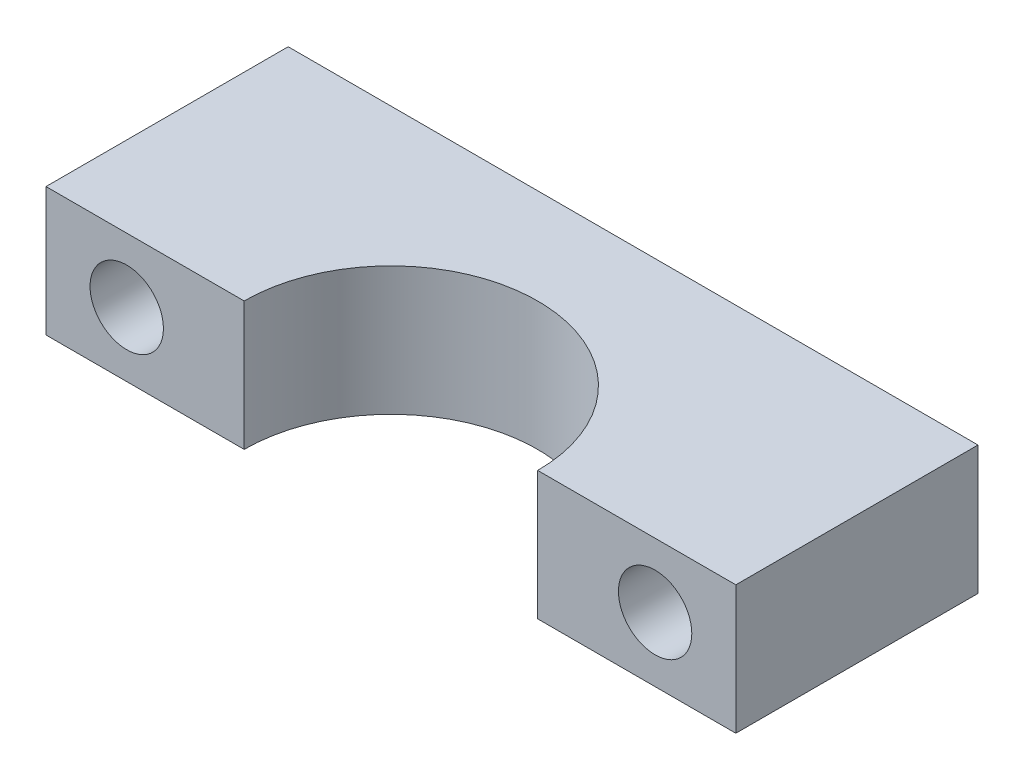
ISO-10303-21;
HEADER;
FILE_DESCRIPTION(('STEP AP214'),'2;1');
FILE_NAME('part.step','',(''),(''),'','','');
FILE_SCHEMA(('AUTOMOTIVE_DESIGN { 1 0 10303 214 1 1 1 1 }'));
ENDSEC;
DATA;
#1=APPLICATION_CONTEXT('core data for automotive mechanical design processes');
#2=APPLICATION_PROTOCOL_DEFINITION('international standard','automotive_design',2000,#1);
#3=PRODUCT_CONTEXT('',#1,'mechanical');
#4=PRODUCT('Part','Part','',(#3));
#5=PRODUCT_RELATED_PRODUCT_CATEGORY('part','',(#4));
#6=PRODUCT_DEFINITION_FORMATION('','',#4);
#7=PRODUCT_DEFINITION_CONTEXT('part definition',#1,'design');
#8=PRODUCT_DEFINITION('design','',#6,#7);
#9=PRODUCT_DEFINITION_SHAPE('','',#8);
#10=(LENGTH_UNIT() NAMED_UNIT(*) SI_UNIT(.MILLI.,.METRE.));
#11=(NAMED_UNIT(*) PLANE_ANGLE_UNIT() SI_UNIT($,.RADIAN.));
#12=(NAMED_UNIT(*) SI_UNIT($,.STERADIAN.) SOLID_ANGLE_UNIT());
#13=UNCERTAINTY_MEASURE_WITH_UNIT(LENGTH_MEASURE(1.E-05),#10,'distance_accuracy_value','');
#14=(GEOMETRIC_REPRESENTATION_CONTEXT(3) GLOBAL_UNCERTAINTY_ASSIGNED_CONTEXT((#13)) GLOBAL_UNIT_ASSIGNED_CONTEXT((#10,
#11,#12)) REPRESENTATION_CONTEXT('',''));
#15=CARTESIAN_POINT('',(0.,0.,0.));
#16=DIRECTION('',(0.,0.,1.));
#17=DIRECTION('',(1.,0.,0.));
#18=AXIS2_PLACEMENT_3D('',#15,#16,#17);
#19=CARTESIAN_POINT('',(0.,5.5626,0.));
#20=DIRECTION('',(0.,-1.,0.));
#21=DIRECTION('',(0.,0.,-1.));
#22=AXIS2_PLACEMENT_3D('',#19,#20,#21);
#23=CYLINDRICAL_SURFACE('',#22,12.7);
#24=CARTESIAN_POINT('',(0.,-5.5626,0.));
#25=DIRECTION('',(0.,-1.,0.));
#26=DIRECTION('',(0.,0.,-1.));
#27=AXIS2_PLACEMENT_3D('',#24,#25,#26);
#28=CIRCLE('',#27,12.7);
#29=CARTESIAN_POINT('',(-12.7,-5.5626,0.));
#30=VERTEX_POINT('',#29);
#31=CARTESIAN_POINT('',(12.7,-5.5626,0.));
#32=VERTEX_POINT('',#31);
#33=EDGE_CURVE('E134',#30,#32,#28,.T.);
#34=ORIENTED_EDGE('',*,*,#33,.T.);
#35=DIRECTION('',(0.,-1.,0.));
#36=VECTOR('',#35,1.);
#37=CARTESIAN_POINT('',(12.7,5.5626,0.));
#38=LINE('',#37,#36);
#39=CARTESIAN_POINT('',(12.7,5.5626,0.));
#40=VERTEX_POINT('',#39);
#41=EDGE_CURVE('E11',#40,#32,#38,.T.);
#42=ORIENTED_EDGE('',*,*,#41,.F.);
#43=CARTESIAN_POINT('',(0.,5.5626,0.));
#44=DIRECTION('',(0.,-1.,0.));
#45=DIRECTION('',(0.,0.,-1.));
#46=AXIS2_PLACEMENT_3D('',#43,#44,#45);
#47=CIRCLE('',#46,12.7);
#48=CARTESIAN_POINT('',(-12.7,5.5626,0.));
#49=VERTEX_POINT('',#48);
#50=EDGE_CURVE('E151',#49,#40,#47,.T.);
#51=ORIENTED_EDGE('',*,*,#50,.F.);
#52=DIRECTION('',(0.,-1.,0.));
#53=VECTOR('',#52,1.);
#54=CARTESIAN_POINT('',(-12.7,5.5626,0.));
#55=LINE('',#54,#53);
#56=EDGE_CURVE('E130',#49,#30,#55,.T.);
#57=ORIENTED_EDGE('',*,*,#56,.T.);
#58=EDGE_LOOP('',(#34,#42,#51,#57));
#59=FACE_BOUND('',#58,.T.);
#60=ADVANCED_FACE('F45',(#59),#23,.F.);
#61=CARTESIAN_POINT('',(29.845,5.5626,0.));
#62=DIRECTION('',(0.,0.,-1.));
#63=DIRECTION('',(-1.,0.,0.));
#64=AXIS2_PLACEMENT_3D('',#61,#62,#63);
#65=PLANE('',#64);
#66=CARTESIAN_POINT('',(22.86,0.,0.));
#67=DIRECTION('',(0.,0.,1.));
#68=DIRECTION('',(1.,0.,0.));
#69=AXIS2_PLACEMENT_3D('',#66,#67,#68);
#70=CIRCLE('',#69,3.175);
#71=CARTESIAN_POINT('',(26.035,0.,0.));
#72=VERTEX_POINT('',#71);
#73=EDGE_CURVE('E207',#72,#72,#70,.T.);
#74=ORIENTED_EDGE('',*,*,#73,.F.);
#75=EDGE_LOOP('',(#74));
#76=FACE_BOUND('',#75,.T.);
#77=DIRECTION('',(1.,0.,0.));
#78=VECTOR('',#77,1.);
#79=CARTESIAN_POINT('',(29.845,-5.5626,0.));
#80=LINE('',#79,#78);
#81=CARTESIAN_POINT('',(29.845,-5.5626,0.));
#82=VERTEX_POINT('',#81);
#83=EDGE_CURVE('E138',#32,#82,#80,.T.);
#84=ORIENTED_EDGE('',*,*,#83,.T.);
#85=DIRECTION('',(0.,-1.,0.));
#86=VECTOR('',#85,1.);
#87=CARTESIAN_POINT('',(29.845,5.5626,0.));
#88=LINE('',#87,#86);
#89=CARTESIAN_POINT('',(29.845,5.5626,0.));
#90=VERTEX_POINT('',#89);
#91=EDGE_CURVE('E54',#90,#82,#88,.T.);
#92=ORIENTED_EDGE('',*,*,#91,.F.);
#93=DIRECTION('',(1.,0.,0.));
#94=VECTOR('',#93,1.);
#95=CARTESIAN_POINT('',(29.845,5.5626,0.));
#96=LINE('',#95,#94);
#97=EDGE_CURVE('E99',#40,#90,#96,.T.);
#98=ORIENTED_EDGE('',*,*,#97,.F.);
#99=ORIENTED_EDGE('',*,*,#41,.T.);
#100=EDGE_LOOP('',(#84,#92,#98,#99));
#101=FACE_BOUND('',#100,.T.);
#102=ADVANCED_FACE('F183',(#76,#101),#65,.F.);
#103=CARTESIAN_POINT('',(29.845,5.5626,-20.955));
#104=DIRECTION('',(-1.,0.,0.));
#105=DIRECTION('',(0.,0.,1.));
#106=AXIS2_PLACEMENT_3D('',#103,#104,#105);
#107=PLANE('',#106);
#108=DIRECTION('',(0.,0.,-1.));
#109=VECTOR('',#108,1.);
#110=CARTESIAN_POINT('',(29.845,-5.5626,-20.955));
#111=LINE('',#110,#109);
#112=CARTESIAN_POINT('',(29.845,-5.5626,-20.955));
#113=VERTEX_POINT('',#112);
#114=EDGE_CURVE('E142',#82,#113,#111,.T.);
#115=ORIENTED_EDGE('',*,*,#114,.T.);
#116=DIRECTION('',(0.,-1.,0.));
#117=VECTOR('',#116,1.);
#118=CARTESIAN_POINT('',(29.845,5.5626,-20.955));
#119=LINE('',#118,#117);
#120=CARTESIAN_POINT('',(29.845,5.5626,-20.955));
#121=VERTEX_POINT('',#120);
#122=EDGE_CURVE('E123',#121,#113,#119,.T.);
#123=ORIENTED_EDGE('',*,*,#122,.F.);
#124=DIRECTION('',(0.,0.,-1.));
#125=VECTOR('',#124,1.);
#126=CARTESIAN_POINT('',(29.845,5.5626,-20.955));
#127=LINE('',#126,#125);
#128=EDGE_CURVE('E112',#90,#121,#127,.T.);
#129=ORIENTED_EDGE('',*,*,#128,.F.);
#130=ORIENTED_EDGE('',*,*,#91,.T.);
#131=EDGE_LOOP('',(#115,#123,#129,#130));
#132=FACE_BOUND('',#131,.T.);
#133=ADVANCED_FACE('F161',(#132),#107,.F.);
#134=CARTESIAN_POINT('',(-29.845,5.5626,-20.955));
#135=DIRECTION('',(0.,0.,1.));
#136=DIRECTION('',(1.,0.,0.));
#137=AXIS2_PLACEMENT_3D('',#134,#135,#136);
#138=PLANE('',#137);
#139=CARTESIAN_POINT('',(-22.86,0.,-20.955));
#140=DIRECTION('',(0.,0.,1.));
#141=DIRECTION('',(1.,0.,0.));
#142=AXIS2_PLACEMENT_3D('',#139,#140,#141);
#143=CIRCLE('',#142,3.175);
#144=CARTESIAN_POINT('',(-19.685,0.,-20.955));
#145=VERTEX_POINT('',#144);
#146=EDGE_CURVE('E139',#145,#145,#143,.T.);
#147=ORIENTED_EDGE('',*,*,#146,.T.);
#148=EDGE_LOOP('',(#147));
#149=FACE_BOUND('',#148,.T.);
#150=CARTESIAN_POINT('',(22.86,0.,-20.955));
#151=DIRECTION('',(0.,0.,1.));
#152=DIRECTION('',(1.,0.,0.));
#153=AXIS2_PLACEMENT_3D('',#150,#151,#152);
#154=CIRCLE('',#153,3.175);
#155=CARTESIAN_POINT('',(26.035,0.,-20.955));
#156=VERTEX_POINT('',#155);
#157=EDGE_CURVE('E203',#156,#156,#154,.T.);
#158=ORIENTED_EDGE('',*,*,#157,.T.);
#159=EDGE_LOOP('',(#158));
#160=FACE_BOUND('',#159,.T.);
#161=DIRECTION('',(-1.,0.,0.));
#162=VECTOR('',#161,1.);
#163=CARTESIAN_POINT('',(-29.845,-5.5626,-20.955));
#164=LINE('',#163,#162);
#165=CARTESIAN_POINT('',(-29.845,-5.5626,-20.955));
#166=VERTEX_POINT('',#165);
#167=EDGE_CURVE('E121',#113,#166,#164,.T.);
#168=ORIENTED_EDGE('',*,*,#167,.T.);
#169=DIRECTION('',(0.,-1.,0.));
#170=VECTOR('',#169,1.);
#171=CARTESIAN_POINT('',(-29.845,5.5626,-20.955));
#172=LINE('',#171,#170);
#173=CARTESIAN_POINT('',(-29.845,5.5626,-20.955));
#174=VERTEX_POINT('',#173);
#175=EDGE_CURVE('E118',#174,#166,#172,.T.);
#176=ORIENTED_EDGE('',*,*,#175,.F.);
#177=DIRECTION('',(-1.,0.,0.));
#178=VECTOR('',#177,1.);
#179=CARTESIAN_POINT('',(-29.845,5.5626,-20.955));
#180=LINE('',#179,#178);
#181=EDGE_CURVE('E106',#121,#174,#180,.T.);
#182=ORIENTED_EDGE('',*,*,#181,.F.);
#183=ORIENTED_EDGE('',*,*,#122,.T.);
#184=EDGE_LOOP('',(#168,#176,#182,#183));
#185=FACE_BOUND('',#184,.T.);
#186=ADVANCED_FACE('F119',(#149,#160,#185),#138,.F.);
#187=CARTESIAN_POINT('',(-29.845,5.5626,0.));
#188=DIRECTION('',(1.,0.,0.));
#189=DIRECTION('',(0.,0.,-1.));
#190=AXIS2_PLACEMENT_3D('',#187,#188,#189);
#191=PLANE('',#190);
#192=DIRECTION('',(0.,0.,1.));
#193=VECTOR('',#192,1.);
#194=CARTESIAN_POINT('',(-29.845,-5.5626,0.));
#195=LINE('',#194,#193);
#196=CARTESIAN_POINT('',(-29.845,-5.5626,0.));
#197=VERTEX_POINT('',#196);
#198=EDGE_CURVE('E85',#166,#197,#195,.T.);
#199=ORIENTED_EDGE('',*,*,#198,.T.);
#200=DIRECTION('',(0.,-1.,0.));
#201=VECTOR('',#200,1.);
#202=CARTESIAN_POINT('',(-29.845,5.5626,0.));
#203=LINE('',#202,#201);
#204=CARTESIAN_POINT('',(-29.845,5.5626,0.));
#205=VERTEX_POINT('',#204);
#206=EDGE_CURVE('E124',#205,#197,#203,.T.);
#207=ORIENTED_EDGE('',*,*,#206,.F.);
#208=DIRECTION('',(0.,0.,1.));
#209=VECTOR('',#208,1.);
#210=CARTESIAN_POINT('',(-29.845,5.5626,0.));
#211=LINE('',#210,#209);
#212=EDGE_CURVE('E110',#174,#205,#211,.T.);
#213=ORIENTED_EDGE('',*,*,#212,.F.);
#214=ORIENTED_EDGE('',*,*,#175,.T.);
#215=EDGE_LOOP('',(#199,#207,#213,#214));
#216=FACE_BOUND('',#215,.T.);
#217=ADVANCED_FACE('F126',(#216),#191,.F.);
#218=CARTESIAN_POINT('',(-12.7,5.5626,0.));
#219=DIRECTION('',(0.,0.,-1.));
#220=DIRECTION('',(-1.,0.,0.));
#221=AXIS2_PLACEMENT_3D('',#218,#219,#220);
#222=PLANE('',#221);
#223=CARTESIAN_POINT('',(-22.86,0.,0.));
#224=DIRECTION('',(0.,0.,1.));
#225=DIRECTION('',(1.,0.,0.));
#226=AXIS2_PLACEMENT_3D('',#223,#224,#225);
#227=CIRCLE('',#226,3.175);
#228=CARTESIAN_POINT('',(-19.685,0.,0.));
#229=VERTEX_POINT('',#228);
#230=EDGE_CURVE('E206',#229,#229,#227,.T.);
#231=ORIENTED_EDGE('',*,*,#230,.F.);
#232=EDGE_LOOP('',(#231));
#233=FACE_BOUND('',#232,.T.);
#234=DIRECTION('',(1.,0.,0.));
#235=VECTOR('',#234,1.);
#236=CARTESIAN_POINT('',(-12.7,-5.5626,0.));
#237=LINE('',#236,#235);
#238=EDGE_CURVE('E91',#197,#30,#237,.T.);
#239=ORIENTED_EDGE('',*,*,#238,.T.);
#240=ORIENTED_EDGE('',*,*,#56,.F.);
#241=DIRECTION('',(1.,0.,0.));
#242=VECTOR('',#241,1.);
#243=CARTESIAN_POINT('',(-12.7,5.5626,0.));
#244=LINE('',#243,#242);
#245=EDGE_CURVE('E62',#205,#49,#244,.T.);
#246=ORIENTED_EDGE('',*,*,#245,.F.);
#247=ORIENTED_EDGE('',*,*,#206,.T.);
#248=EDGE_LOOP('',(#239,#240,#246,#247));
#249=FACE_BOUND('',#248,.T.);
#250=ADVANCED_FACE('F168',(#233,#249),#222,.F.);
#251=CARTESIAN_POINT('',(0.,5.5626,0.));
#252=DIRECTION('',(0.,-1.,0.));
#253=DIRECTION('',(0.,0.,-1.));
#254=AXIS2_PLACEMENT_3D('',#251,#252,#253);
#255=PLANE('',#254);
#256=ORIENTED_EDGE('',*,*,#50,.T.);
#257=ORIENTED_EDGE('',*,*,#97,.T.);
#258=ORIENTED_EDGE('',*,*,#128,.T.);
#259=ORIENTED_EDGE('',*,*,#181,.T.);
#260=ORIENTED_EDGE('',*,*,#212,.T.);
#261=ORIENTED_EDGE('',*,*,#245,.T.);
#262=EDGE_LOOP('',(#256,#257,#258,#259,#260,#261));
#263=FACE_BOUND('',#262,.T.);
#264=ADVANCED_FACE('F108',(#263),#255,.F.);
#265=CARTESIAN_POINT('',(0.,-5.5626,0.));
#266=DIRECTION('',(0.,-1.,0.));
#267=DIRECTION('',(0.,0.,-1.));
#268=AXIS2_PLACEMENT_3D('',#265,#266,#267);
#269=PLANE('',#268);
#270=ORIENTED_EDGE('',*,*,#33,.F.);
#271=ORIENTED_EDGE('',*,*,#238,.F.);
#272=ORIENTED_EDGE('',*,*,#198,.F.);
#273=ORIENTED_EDGE('',*,*,#167,.F.);
#274=ORIENTED_EDGE('',*,*,#114,.F.);
#275=ORIENTED_EDGE('',*,*,#83,.F.);
#276=EDGE_LOOP('',(#270,#271,#272,#273,#274,#275));
#277=FACE_BOUND('',#276,.T.);
#278=ADVANCED_FACE('F164',(#277),#269,.T.);
#279=CARTESIAN_POINT('',(-22.86,0.,-20.955));
#280=DIRECTION('',(0.,0.,1.));
#281=DIRECTION('',(1.,0.,0.));
#282=AXIS2_PLACEMENT_3D('',#279,#280,#281);
#283=CYLINDRICAL_SURFACE('',#282,3.175);
#284=ORIENTED_EDGE('',*,*,#146,.F.);
#285=EDGE_LOOP('',(#284));
#286=FACE_BOUND('',#285,.T.);
#287=ORIENTED_EDGE('',*,*,#230,.T.);
#288=EDGE_LOOP('',(#287));
#289=FACE_BOUND('',#288,.T.);
#290=ADVANCED_FACE('F225',(#286,#289),#283,.F.);
#291=CARTESIAN_POINT('',(22.86,0.,-20.955));
#292=DIRECTION('',(0.,0.,1.));
#293=DIRECTION('',(1.,0.,0.));
#294=AXIS2_PLACEMENT_3D('',#291,#292,#293);
#295=CYLINDRICAL_SURFACE('',#294,3.175);
#296=ORIENTED_EDGE('',*,*,#157,.F.);
#297=EDGE_LOOP('',(#296));
#298=FACE_BOUND('',#297,.T.);
#299=ORIENTED_EDGE('',*,*,#73,.T.);
#300=EDGE_LOOP('',(#299));
#301=FACE_BOUND('',#300,.T.);
#302=ADVANCED_FACE('F223',(#298,#301),#295,.F.);
#303=CLOSED_SHELL('',(#60,#102,#133,#186,#217,#250,#264,#278,#290,#302));
#304=MANIFOLD_SOLID_BREP('B2',#303);
#305=ADVANCED_BREP_SHAPE_REPRESENTATION('',(#18,#304),#14);
#306=SHAPE_DEFINITION_REPRESENTATION(#9,#305);
ENDSEC;
END-ISO-10303-21;
